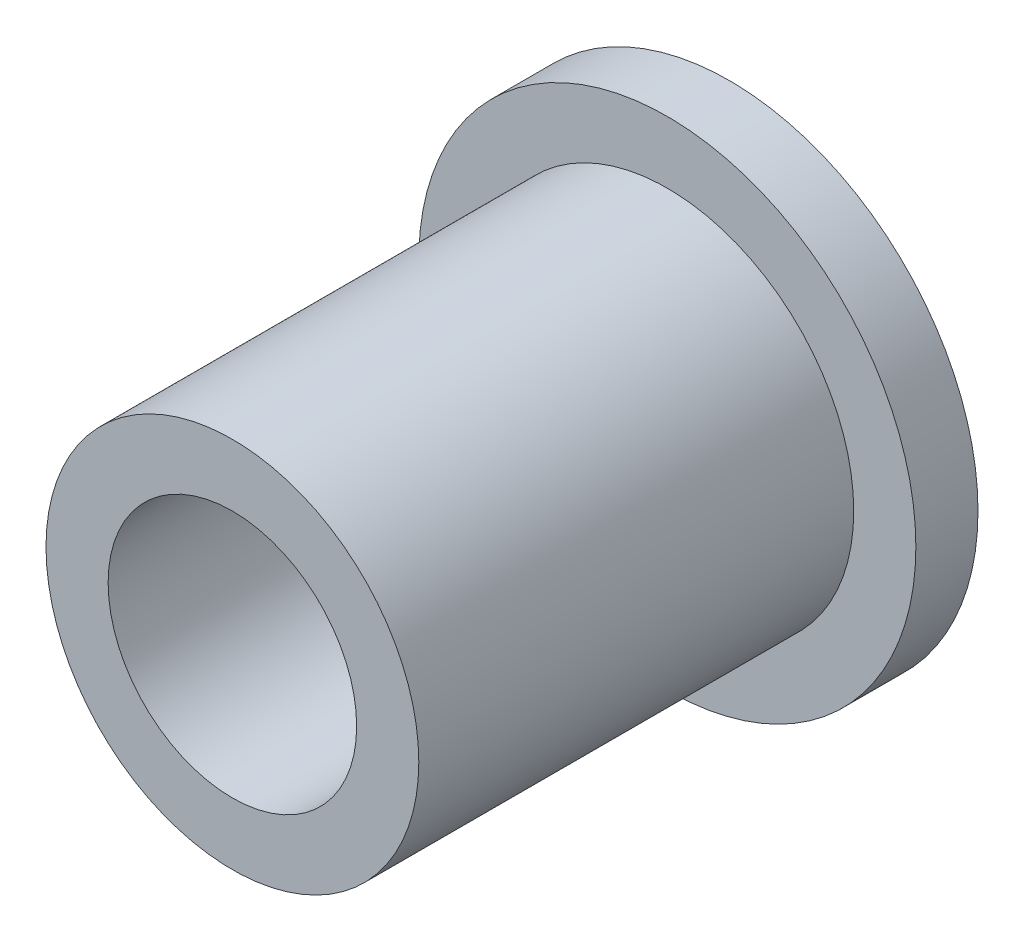
ISO-10303-21;
HEADER;
FILE_DESCRIPTION(('STEP AP214'),'2;1');
FILE_NAME('part.step','',(''),(''),'','','');
FILE_SCHEMA(('AUTOMOTIVE_DESIGN { 1 0 10303 214 1 1 1 1 }'));
ENDSEC;
DATA;
#1=APPLICATION_CONTEXT('core data for automotive mechanical design processes');
#2=APPLICATION_PROTOCOL_DEFINITION('international standard','automotive_design',2000,#1);
#3=PRODUCT_CONTEXT('',#1,'mechanical');
#4=PRODUCT('Part','Part','',(#3));
#5=PRODUCT_RELATED_PRODUCT_CATEGORY('part','',(#4));
#6=PRODUCT_DEFINITION_FORMATION('','',#4);
#7=PRODUCT_DEFINITION_CONTEXT('part definition',#1,'design');
#8=PRODUCT_DEFINITION('design','',#6,#7);
#9=PRODUCT_DEFINITION_SHAPE('','',#8);
#10=(LENGTH_UNIT() NAMED_UNIT(*) SI_UNIT(.MILLI.,.METRE.));
#11=(NAMED_UNIT(*) PLANE_ANGLE_UNIT() SI_UNIT($,.RADIAN.));
#12=(NAMED_UNIT(*) SI_UNIT($,.STERADIAN.) SOLID_ANGLE_UNIT());
#13=UNCERTAINTY_MEASURE_WITH_UNIT(LENGTH_MEASURE(1.E-05),#10,'distance_accuracy_value','');
#14=(GEOMETRIC_REPRESENTATION_CONTEXT(3) GLOBAL_UNCERTAINTY_ASSIGNED_CONTEXT((#13)) GLOBAL_UNIT_ASSIGNED_CONTEXT((#10,
#11,#12)) REPRESENTATION_CONTEXT('',''));
#15=CARTESIAN_POINT('',(0.,0.,0.));
#16=DIRECTION('',(0.,0.,1.));
#17=DIRECTION('',(1.,0.,0.));
#18=AXIS2_PLACEMENT_3D('',#15,#16,#17);
#19=CARTESIAN_POINT('',(0.,0.,0.));
#20=DIRECTION('',(0.,0.,1.));
#21=DIRECTION('',(1.,0.,0.));
#22=AXIS2_PLACEMENT_3D('',#19,#20,#21);
#23=CYLINDRICAL_SURFACE('',#22,3.17499999999999);
#24=CARTESIAN_POINT('',(0.,0.,-12.7));
#25=DIRECTION('',(0.,0.,1.));
#26=DIRECTION('',(1.,0.,0.));
#27=AXIS2_PLACEMENT_3D('',#24,#25,#26);
#28=CIRCLE('',#27,3.175);
#29=CARTESIAN_POINT('',(3.175,0.,-12.7));
#30=VERTEX_POINT('',#29);
#31=EDGE_CURVE('E53',#30,#30,#28,.T.);
#32=ORIENTED_EDGE('',*,*,#31,.F.);
#33=EDGE_LOOP('',(#32));
#34=FACE_BOUND('',#33,.T.);
#35=CARTESIAN_POINT('',(0.,0.,0.));
#36=DIRECTION('',(0.,0.,1.));
#37=DIRECTION('',(1.,0.,0.));
#38=AXIS2_PLACEMENT_3D('',#35,#36,#37);
#39=CIRCLE('',#38,3.17499999999999);
#40=CARTESIAN_POINT('',(3.17499999999999,0.,0.));
#41=VERTEX_POINT('',#40);
#42=EDGE_CURVE('E10',#41,#41,#39,.T.);
#43=ORIENTED_EDGE('',*,*,#42,.T.);
#44=EDGE_LOOP('',(#43));
#45=FACE_BOUND('',#44,.T.);
#46=ADVANCED_FACE('F31',(#34,#45),#23,.F.);
#47=CARTESIAN_POINT('',(0.,3.17499999999999,0.));
#48=DIRECTION('',(0.,0.,-1.));
#49=DIRECTION('',(-1.,0.,0.));
#50=AXIS2_PLACEMENT_3D('',#47,#48,#49);
#51=PLANE('',#50);
#52=ORIENTED_EDGE('',*,*,#42,.F.);
#53=EDGE_LOOP('',(#52));
#54=FACE_BOUND('',#53,.T.);
#55=CARTESIAN_POINT('',(0.,0.,0.));
#56=DIRECTION('',(0.,0.,1.));
#57=DIRECTION('',(1.,0.,0.));
#58=AXIS2_PLACEMENT_3D('',#55,#56,#57);
#59=CIRCLE('',#58,4.7625);
#60=CARTESIAN_POINT('',(4.7625,0.,0.));
#61=VERTEX_POINT('',#60);
#62=EDGE_CURVE('E37',#61,#61,#59,.T.);
#63=ORIENTED_EDGE('',*,*,#62,.T.);
#64=EDGE_LOOP('',(#63));
#65=FACE_BOUND('',#64,.T.);
#66=ADVANCED_FACE('F60',(#54,#65),#51,.F.);
#67=CARTESIAN_POINT('',(0.,0.,0.));
#68=DIRECTION('',(0.,0.,1.));
#69=DIRECTION('',(1.,0.,0.));
#70=AXIS2_PLACEMENT_3D('',#67,#68,#69);
#71=CYLINDRICAL_SURFACE('',#70,4.7625);
#72=ORIENTED_EDGE('',*,*,#62,.F.);
#73=EDGE_LOOP('',(#72));
#74=FACE_BOUND('',#73,.T.);
#75=CARTESIAN_POINT('',(0.,0.,-11.1125));
#76=DIRECTION('',(0.,0.,1.));
#77=DIRECTION('',(1.,0.,0.));
#78=AXIS2_PLACEMENT_3D('',#75,#76,#77);
#79=CIRCLE('',#78,4.7625);
#80=CARTESIAN_POINT('',(4.7625,0.,-11.1125));
#81=VERTEX_POINT('',#80);
#82=EDGE_CURVE('E41',#81,#81,#79,.T.);
#83=ORIENTED_EDGE('',*,*,#82,.T.);
#84=EDGE_LOOP('',(#83));
#85=FACE_BOUND('',#84,.T.);
#86=ADVANCED_FACE('F64',(#74,#85),#71,.T.);
#87=CARTESIAN_POINT('',(0.,4.7625,-11.1125));
#88=DIRECTION('',(0.,0.,-1.));
#89=DIRECTION('',(-1.,0.,0.));
#90=AXIS2_PLACEMENT_3D('',#87,#88,#89);
#91=PLANE('',#90);
#92=ORIENTED_EDGE('',*,*,#82,.F.);
#93=EDGE_LOOP('',(#92));
#94=FACE_BOUND('',#93,.T.);
#95=CARTESIAN_POINT('',(0.,0.,-11.1125));
#96=DIRECTION('',(0.,0.,1.));
#97=DIRECTION('',(1.,0.,0.));
#98=AXIS2_PLACEMENT_3D('',#95,#96,#97);
#99=CIRCLE('',#98,6.35);
#100=CARTESIAN_POINT('',(6.35,0.,-11.1125));
#101=VERTEX_POINT('',#100);
#102=EDGE_CURVE('E45',#101,#101,#99,.T.);
#103=ORIENTED_EDGE('',*,*,#102,.T.);
#104=EDGE_LOOP('',(#103));
#105=FACE_BOUND('',#104,.T.);
#106=ADVANCED_FACE('F69',(#94,#105),#91,.F.);
#107=CARTESIAN_POINT('',(0.,0.,0.));
#108=DIRECTION('',(0.,0.,1.));
#109=DIRECTION('',(1.,0.,0.));
#110=AXIS2_PLACEMENT_3D('',#107,#108,#109);
#111=CYLINDRICAL_SURFACE('',#110,6.35);
#112=ORIENTED_EDGE('',*,*,#102,.F.);
#113=EDGE_LOOP('',(#112));
#114=FACE_BOUND('',#113,.T.);
#115=CARTESIAN_POINT('',(0.,0.,-12.7));
#116=DIRECTION('',(0.,0.,1.));
#117=DIRECTION('',(1.,0.,0.));
#118=AXIS2_PLACEMENT_3D('',#115,#116,#117);
#119=CIRCLE('',#118,6.35);
#120=CARTESIAN_POINT('',(6.35,0.,-12.7));
#121=VERTEX_POINT('',#120);
#122=EDGE_CURVE('E50',#121,#121,#119,.T.);
#123=ORIENTED_EDGE('',*,*,#122,.T.);
#124=EDGE_LOOP('',(#123));
#125=FACE_BOUND('',#124,.T.);
#126=ADVANCED_FACE('F75',(#114,#125),#111,.T.);
#127=CARTESIAN_POINT('',(0.,6.35,-12.7));
#128=DIRECTION('',(0.,0.,1.));
#129=DIRECTION('',(1.,0.,0.));
#130=AXIS2_PLACEMENT_3D('',#127,#128,#129);
#131=PLANE('',#130);
#132=ORIENTED_EDGE('',*,*,#122,.F.);
#133=EDGE_LOOP('',(#132));
#134=FACE_BOUND('',#133,.T.);
#135=ORIENTED_EDGE('',*,*,#31,.T.);
#136=EDGE_LOOP('',(#135));
#137=FACE_BOUND('',#136,.T.);
#138=ADVANCED_FACE('F57',(#134,#137),#131,.F.);
#139=CLOSED_SHELL('',(#46,#66,#86,#106,#126,#138));
#140=MANIFOLD_SOLID_BREP('B2',#139);
#141=ADVANCED_BREP_SHAPE_REPRESENTATION('',(#18,#140),#14);
#142=SHAPE_DEFINITION_REPRESENTATION(#9,#141);
ENDSEC;
END-ISO-10303-21;
